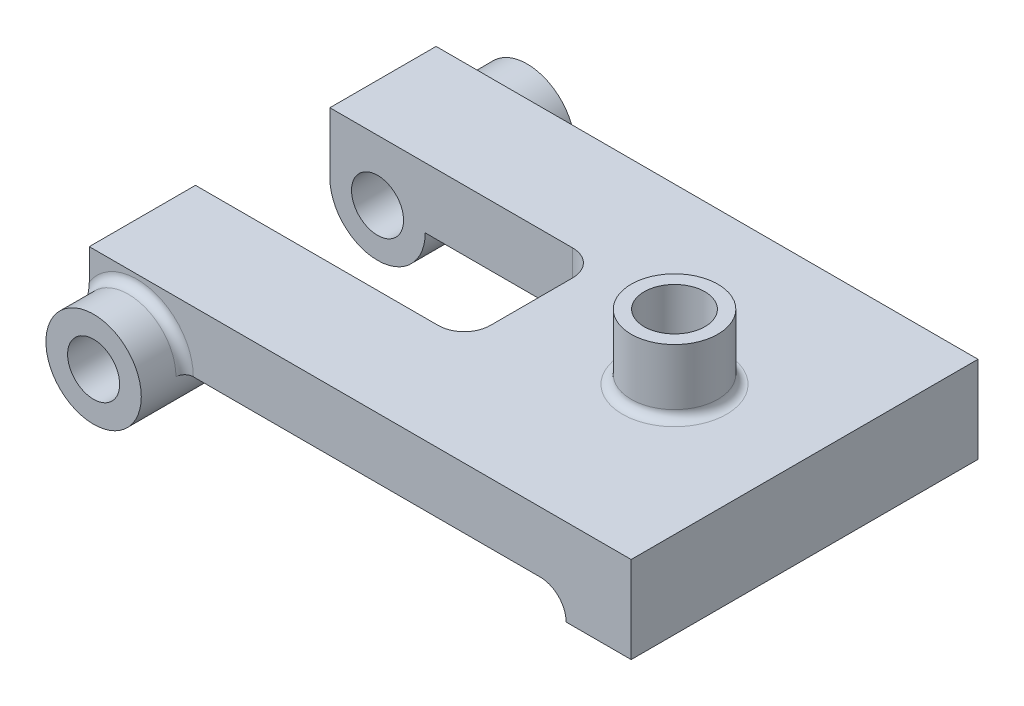
ISO-10303-21;
HEADER;
FILE_DESCRIPTION(('STEP AP214'),'2;1');
FILE_NAME('part.step','',(''),(''),'','','');
FILE_SCHEMA(('AUTOMOTIVE_DESIGN { 1 0 10303 214 1 1 1 1 }'));
ENDSEC;
DATA;
#1=APPLICATION_CONTEXT('core data for automotive mechanical design processes');
#2=APPLICATION_PROTOCOL_DEFINITION('international standard','automotive_design',2000,#1);
#3=PRODUCT_CONTEXT('',#1,'mechanical');
#4=PRODUCT('Part','Part','',(#3));
#5=PRODUCT_RELATED_PRODUCT_CATEGORY('part','',(#4));
#6=PRODUCT_DEFINITION_FORMATION('','',#4);
#7=PRODUCT_DEFINITION_CONTEXT('part definition',#1,'design');
#8=PRODUCT_DEFINITION('design','',#6,#7);
#9=PRODUCT_DEFINITION_SHAPE('','',#8);
#10=(LENGTH_UNIT() NAMED_UNIT(*) SI_UNIT(.MILLI.,.METRE.));
#11=(NAMED_UNIT(*) PLANE_ANGLE_UNIT() SI_UNIT($,.RADIAN.));
#12=(NAMED_UNIT(*) SI_UNIT($,.STERADIAN.) SOLID_ANGLE_UNIT());
#13=UNCERTAINTY_MEASURE_WITH_UNIT(LENGTH_MEASURE(1.E-05),#10,'distance_accuracy_value','');
#14=(GEOMETRIC_REPRESENTATION_CONTEXT(3) GLOBAL_UNCERTAINTY_ASSIGNED_CONTEXT((#13)) GLOBAL_UNIT_ASSIGNED_CONTEXT((#10,
#11,#12)) REPRESENTATION_CONTEXT('',''));
#15=CARTESIAN_POINT('',(0.,0.,0.));
#16=DIRECTION('',(0.,0.,1.));
#17=DIRECTION('',(1.,0.,0.));
#18=AXIS2_PLACEMENT_3D('',#15,#16,#17);
#19=CARTESIAN_POINT('',(0.,0.,40.));
#20=DIRECTION('',(-1.,0.,0.));
#21=DIRECTION('',(0.,0.,1.));
#22=AXIS2_PLACEMENT_3D('',#19,#20,#21);
#23=PLANE('',#22);
#24=DIRECTION('',(0.,0.,-1.));
#25=VECTOR('',#24,1.);
#26=CARTESIAN_POINT('',(0.,0.,40.));
#27=LINE('',#26,#25);
#28=CARTESIAN_POINT('',(0.,0.,-15.5));
#29=VERTEX_POINT('',#28);
#30=CARTESIAN_POINT('',(0.,0.,-42.));
#31=VERTEX_POINT('',#30);
#32=EDGE_CURVE('E313',#29,#31,#27,.T.);
#33=ORIENTED_EDGE('',*,*,#32,.F.);
#34=DIRECTION('',(0.,1.,0.));
#35=VECTOR('',#34,1.);
#36=CARTESIAN_POINT('',(0.,-11.,-15.5));
#37=LINE('',#36,#35);
#38=CARTESIAN_POINT('',(0.,14.,-15.5));
#39=VERTEX_POINT('',#38);
#40=EDGE_CURVE('E170',#29,#39,#37,.T.);
#41=ORIENTED_EDGE('',*,*,#40,.T.);
#42=DIRECTION('',(0.,0.,-1.));
#43=VECTOR('',#42,1.);
#44=CARTESIAN_POINT('',(0.,14.,40.));
#45=LINE('',#44,#43);
#46=CARTESIAN_POINT('',(0.,14.,-40.));
#47=VERTEX_POINT('',#46);
#48=EDGE_CURVE('E183',#39,#47,#45,.T.);
#49=ORIENTED_EDGE('',*,*,#48,.T.);
#50=DIRECTION('',(0.,1.,0.));
#51=VECTOR('',#50,1.);
#52=CARTESIAN_POINT('',(0.,0.,-40.));
#53=LINE('',#52,#51);
#54=CARTESIAN_POINT('',(0.,6.9282032302755,-40.));
#55=VERTEX_POINT('',#54);
#56=EDGE_CURVE('E337',#55,#47,#53,.T.);
#57=ORIENTED_EDGE('',*,*,#56,.F.);
#58=CARTESIAN_POINT('',(0.,6.9282032302755,-40.));
#59=CARTESIAN_POINT('',(0.,6.79631878338515,-40.0000195877206));
#60=CARTESIAN_POINT('',(0.,6.66447731425405,-40.0037039568171));
#61=CARTESIAN_POINT('',(0.,6.40121335984436,-40.0176384033789));
#62=CARTESIAN_POINT('',(0.,6.2697906737488,-40.0278846179914));
#63=CARTESIAN_POINT('',(0.,6.00790763005022,-40.05414400863));
#64=CARTESIAN_POINT('',(0.,5.87744561018524,-40.0701410055858));
#65=CARTESIAN_POINT('',(0.,5.61724352656419,-40.1072767015456));
#66=CARTESIAN_POINT('',(0.,5.4875035837544,-40.1284162368862));
#67=CARTESIAN_POINT('',(0.,5.10222369832736,-40.1981930126904));
#68=CARTESIAN_POINT('',(0.,4.84787990643123,-40.2534888297207));
#69=CARTESIAN_POINT('',(0.,4.34256909228552,-40.3782545428355));
#70=CARTESIAN_POINT('',(0.,4.09160501060091,-40.4477360266856));
#71=CARTESIAN_POINT('',(0.,3.51579220612546,-40.6210301613932));
#72=CARTESIAN_POINT('',(0.,3.19214679587766,-40.7288093836499));
#73=CARTESIAN_POINT('',(0.,2.54957173398174,-40.9576910405922));
#74=CARTESIAN_POINT('',(0.,2.23064375632853,-41.0787980818531));
#75=CARTESIAN_POINT('',(0.,1.27744390125108,-41.4553689198575));
#76=CARTESIAN_POINT('',(0.,0.648288026437424,-41.723569788079));
#77=CARTESIAN_POINT('',(0.,0.012863507876059,-41.9945149951134));
#78=CARTESIAN_POINT('',(0.,0.00643174896310646,-41.9972575065248));
#79=CARTESIAN_POINT('',(0.,0.,-42.));
#80=B_SPLINE_CURVE_WITH_KNOTS('',3,(#58,#59,#60,#61,#62,#63,#64,#65,#66,#67,#68,#69,#70,#71,#72,
#73,#74,#75,#76,#77,#78,#79),.UNSPECIFIED.,.F.,.F.,(4,2,2,2,2,2,2,2,2,2,4),(0.,0.39554064276329,
0.790848650889556,1.18505310551353,1.57932171293813,2.35959856433535,3.14051536472971,
4.16341984179175,5.18667898860517,7.23803512077279,7.25901129773622),.UNSPECIFIED.);
#81=EDGE_CURVE('E242',#55,#31,#80,.T.);
#82=ORIENTED_EDGE('',*,*,#81,.T.);
#83=EDGE_LOOP('',(#33,#41,#49,#57,#82));
#84=FACE_BOUND('',#83,.T.);
#85=ADVANCED_FACE('F41',(#84),#23,.T.);
#86=CARTESIAN_POINT('',(11.,0.,40.));
#87=DIRECTION('',(0.,0.,-1.));
#88=DIRECTION('',(-1.,0.,0.));
#89=AXIS2_PLACEMENT_3D('',#86,#87,#88);
#90=CYLINDRICAL_SURFACE('',#89,11.);
#91=CARTESIAN_POINT('',(11.,0.,50.));
#92=DIRECTION('',(0.,0.,1.));
#93=DIRECTION('',(1.,0.,0.));
#94=AXIS2_PLACEMENT_3D('',#91,#92,#93);
#95=CIRCLE('',#94,11.);
#96=CARTESIAN_POINT('',(22.,0.,50.));
#97=VERTEX_POINT('',#96);
#98=EDGE_CURVE('E330',#97,#97,#95,.T.);
#99=ORIENTED_EDGE('',*,*,#98,.F.);
#100=EDGE_LOOP('',(#99));
#101=FACE_BOUND('',#100,.T.);
#102=DIRECTION('',(0.,0.,-1.));
#103=VECTOR('',#102,1.);
#104=CARTESIAN_POINT('',(22.,0.,40.));
#105=LINE('',#104,#103);
#106=CARTESIAN_POINT('',(22.,0.,42.));
#107=VERTEX_POINT('',#106);
#108=CARTESIAN_POINT('',(22.,0.,15.5));
#109=VERTEX_POINT('',#108);
#110=EDGE_CURVE('E65',#107,#109,#105,.T.);
#111=ORIENTED_EDGE('',*,*,#110,.F.);
#112=CARTESIAN_POINT('',(11.,0.,42.));
#113=DIRECTION('',(0.,0.,1.));
#114=DIRECTION('',(1.,0.,0.));
#115=AXIS2_PLACEMENT_3D('',#112,#113,#114);
#116=CIRCLE('',#115,11.);
#117=CARTESIAN_POINT('',(0.,0.,42.));
#118=VERTEX_POINT('',#117);
#119=EDGE_CURVE('E239',#107,#118,#116,.T.);
#120=ORIENTED_EDGE('',*,*,#119,.T.);
#121=CARTESIAN_POINT('',(0.,0.,15.5));
#122=VERTEX_POINT('',#121);
#123=EDGE_CURVE('E67',#118,#122,#27,.T.);
#124=ORIENTED_EDGE('',*,*,#123,.T.);
#125=CARTESIAN_POINT('',(11.,0.,15.5));
#126=DIRECTION('',(0.,0.,1.));
#127=DIRECTION('',(1.,0.,0.));
#128=AXIS2_PLACEMENT_3D('',#125,#126,#127);
#129=CIRCLE('',#128,11.);
#130=EDGE_CURVE('E164',#122,#109,#129,.T.);
#131=ORIENTED_EDGE('',*,*,#130,.T.);
#132=EDGE_LOOP('',(#111,#120,#124,#131));
#133=FACE_BOUND('',#132,.T.);
#134=ADVANCED_FACE('F283',(#101,#133),#90,.T.);
#135=CARTESIAN_POINT('',(11.,0.,40.));
#136=DIRECTION('',(0.,0.,-1.));
#137=DIRECTION('',(-1.,0.,0.));
#138=AXIS2_PLACEMENT_3D('',#135,#136,#137);
#139=CYLINDRICAL_SURFACE('',#138,6.);
#140=CARTESIAN_POINT('',(11.,0.,-15.5));
#141=DIRECTION('',(0.,0.,-1.));
#142=DIRECTION('',(-1.,0.,0.));
#143=AXIS2_PLACEMENT_3D('',#140,#141,#142);
#144=CIRCLE('',#143,6.);
#145=CARTESIAN_POINT('',(4.99999999999999,0.,-15.5));
#146=VERTEX_POINT('',#145);
#147=EDGE_CURVE('E202',#146,#146,#144,.T.);
#148=ORIENTED_EDGE('',*,*,#147,.F.);
#149=EDGE_LOOP('',(#148));
#150=FACE_BOUND('',#149,.T.);
#151=CARTESIAN_POINT('',(11.,0.,-50.));
#152=DIRECTION('',(0.,0.,1.));
#153=DIRECTION('',(1.,0.,0.));
#154=AXIS2_PLACEMENT_3D('',#151,#152,#153);
#155=CIRCLE('',#154,6.);
#156=CARTESIAN_POINT('',(17.,0.,-50.));
#157=VERTEX_POINT('',#156);
#158=EDGE_CURVE('E430',#157,#157,#155,.T.);
#159=ORIENTED_EDGE('',*,*,#158,.F.);
#160=EDGE_LOOP('',(#159));
#161=FACE_BOUND('',#160,.T.);
#162=ADVANCED_FACE('F285',(#150,#161),#139,.F.);
#163=CARTESIAN_POINT('',(11.,0.,-42.));
#164=DIRECTION('',(0.,0.,1.));
#165=DIRECTION('',(1.,0.,0.));
#166=AXIS2_PLACEMENT_3D('',#163,#164,#165);
#167=CIRCLE('',#166,11.);
#168=CARTESIAN_POINT('',(22.,0.,-42.));
#169=VERTEX_POINT('',#168);
#170=EDGE_CURVE('E233',#31,#169,#167,.F.);
#171=ORIENTED_EDGE('',*,*,#170,.T.);
#172=CARTESIAN_POINT('',(22.,0.,-15.5));
#173=VERTEX_POINT('',#172);
#174=EDGE_CURVE('E196',#173,#169,#105,.T.);
#175=ORIENTED_EDGE('',*,*,#174,.F.);
#176=CARTESIAN_POINT('',(11.,0.,-15.5));
#177=DIRECTION('',(0.,0.,-1.));
#178=DIRECTION('',(-1.,0.,0.));
#179=AXIS2_PLACEMENT_3D('',#176,#177,#178);
#180=CIRCLE('',#179,11.);
#181=EDGE_CURVE('E425',#173,#29,#180,.T.);
#182=ORIENTED_EDGE('',*,*,#181,.T.);
#183=ORIENTED_EDGE('',*,*,#32,.T.);
#184=EDGE_LOOP('',(#171,#175,#182,#183));
#185=FACE_BOUND('',#184,.T.);
#186=CARTESIAN_POINT('',(11.,0.,-50.));
#187=DIRECTION('',(0.,0.,1.));
#188=DIRECTION('',(1.,0.,0.));
#189=AXIS2_PLACEMENT_3D('',#186,#187,#188);
#190=CIRCLE('',#189,11.);
#191=CARTESIAN_POINT('',(22.,0.,-50.));
#192=VERTEX_POINT('',#191);
#193=EDGE_CURVE('E348',#192,#192,#190,.T.);
#194=ORIENTED_EDGE('',*,*,#193,.T.);
#195=EDGE_LOOP('',(#194));
#196=FACE_BOUND('',#195,.T.);
#197=ADVANCED_FACE('F279',(#185,#196),#90,.T.);
#198=CARTESIAN_POINT('',(0.,0.,40.));
#199=DIRECTION('',(0.,-1.,0.));
#200=DIRECTION('',(0.,0.,-1.));
#201=AXIS2_PLACEMENT_3D('',#198,#199,#200);
#202=PLANE('',#201);
#203=CARTESIAN_POINT('',(95.,0.,0.));
#204=DIRECTION('',(0.,-1.,0.));
#205=DIRECTION('',(0.,0.,-1.));
#206=AXIS2_PLACEMENT_3D('',#203,#204,#205);
#207=CIRCLE('',#206,6.99999999999999);
#208=CARTESIAN_POINT('',(95.,0.,-6.99999999999999));
#209=VERTEX_POINT('',#208);
#210=EDGE_CURVE('E177',#209,#209,#207,.T.);
#211=ORIENTED_EDGE('',*,*,#210,.F.);
#212=EDGE_LOOP('',(#211));
#213=FACE_BOUND('',#212,.T.);
#214=DIRECTION('',(1.,0.,0.));
#215=VECTOR('',#214,1.);
#216=CARTESIAN_POINT('',(0.,0.,-15.5));
#217=LINE('',#216,#215);
#218=CARTESIAN_POINT('',(56.,0.,-15.5));
#219=VERTEX_POINT('',#218);
#220=EDGE_CURVE('E208',#173,#219,#217,.T.);
#221=ORIENTED_EDGE('',*,*,#220,.F.);
#222=ORIENTED_EDGE('',*,*,#174,.T.);
#223=CARTESIAN_POINT('',(24.,0.,-42.));
#224=DIRECTION('',(0.,-1.,0.));
#225=DIRECTION('',(0.,0.,-1.));
#226=AXIS2_PLACEMENT_3D('',#223,#224,#225);
#227=CIRCLE('',#226,2.);
#228=CARTESIAN_POINT('',(24.,0.,-40.));
#229=VERTEX_POINT('',#228);
#230=EDGE_CURVE('E241',#169,#229,#227,.F.);
#231=ORIENTED_EDGE('',*,*,#230,.T.);
#232=DIRECTION('',(-1.,0.,0.));
#233=VECTOR('',#232,1.);
#234=CARTESIAN_POINT('',(0.,0.,-40.));
#235=LINE('',#234,#233);
#236=CARTESIAN_POINT('',(104.,0.,-40.));
#237=VERTEX_POINT('',#236);
#238=EDGE_CURVE('E323',#237,#229,#235,.T.);
#239=ORIENTED_EDGE('',*,*,#238,.F.);
#240=DIRECTION('',(0.,0.,-1.));
#241=VECTOR('',#240,1.);
#242=CARTESIAN_POINT('',(104.,0.,40.));
#243=LINE('',#242,#241);
#244=CARTESIAN_POINT('',(104.,0.,40.));
#245=VERTEX_POINT('',#244);
#246=EDGE_CURVE('E198',#245,#237,#243,.T.);
#247=ORIENTED_EDGE('',*,*,#246,.F.);
#248=DIRECTION('',(-1.,0.,0.));
#249=VECTOR('',#248,1.);
#250=CARTESIAN_POINT('',(0.,0.,40.));
#251=LINE('',#250,#249);
#252=CARTESIAN_POINT('',(24.,0.,40.));
#253=VERTEX_POINT('',#252);
#254=EDGE_CURVE('E338',#245,#253,#251,.T.);
#255=ORIENTED_EDGE('',*,*,#254,.T.);
#256=CARTESIAN_POINT('',(24.,0.,42.));
#257=DIRECTION('',(0.,-1.,0.));
#258=DIRECTION('',(0.,0.,-1.));
#259=AXIS2_PLACEMENT_3D('',#256,#257,#258);
#260=CIRCLE('',#259,2.);
#261=EDGE_CURVE('E54',#253,#107,#260,.F.);
#262=ORIENTED_EDGE('',*,*,#261,.T.);
#263=ORIENTED_EDGE('',*,*,#110,.T.);
#264=DIRECTION('',(-1.,0.,0.));
#265=VECTOR('',#264,1.);
#266=CARTESIAN_POINT('',(0.,0.,15.5));
#267=LINE('',#266,#265);
#268=CARTESIAN_POINT('',(56.,0.,15.5));
#269=VERTEX_POINT('',#268);
#270=EDGE_CURVE('E204',#269,#109,#267,.T.);
#271=ORIENTED_EDGE('',*,*,#270,.F.);
#272=CARTESIAN_POINT('',(56.,0.,9.5));
#273=DIRECTION('',(0.,-1.,0.));
#274=DIRECTION('',(0.,0.,-1.));
#275=AXIS2_PLACEMENT_3D('',#272,#273,#274);
#276=CIRCLE('',#275,6.);
#277=CARTESIAN_POINT('',(62.,0.,9.5));
#278=VERTEX_POINT('',#277);
#279=EDGE_CURVE('E218',#269,#278,#276,.F.);
#280=ORIENTED_EDGE('',*,*,#279,.T.);
#281=DIRECTION('',(0.,0.,1.));
#282=VECTOR('',#281,1.);
#283=CARTESIAN_POINT('',(62.,0.,40.));
#284=LINE('',#283,#282);
#285=CARTESIAN_POINT('',(62.,0.,-9.49999999999999));
#286=VERTEX_POINT('',#285);
#287=EDGE_CURVE('E424',#286,#278,#284,.T.);
#288=ORIENTED_EDGE('',*,*,#287,.F.);
#289=CARTESIAN_POINT('',(56.,0.,-9.49999999999999));
#290=DIRECTION('',(0.,-1.,0.));
#291=DIRECTION('',(0.,0.,-1.));
#292=AXIS2_PLACEMENT_3D('',#289,#290,#291);
#293=CIRCLE('',#292,6.);
#294=EDGE_CURVE('E224',#286,#219,#293,.F.);
#295=ORIENTED_EDGE('',*,*,#294,.T.);
#296=EDGE_LOOP('',(#221,#222,#231,#239,#247,#255,#262,#263,#271,#280,#288,#295));
#297=FACE_BOUND('',#296,.T.);
#298=ADVANCED_FACE('F273',(#213,#297),#202,.T.);
#299=CARTESIAN_POINT('',(104.,-6.,40.));
#300=DIRECTION('',(0.,0.,-1.));
#301=DIRECTION('',(-1.,0.,0.));
#302=AXIS2_PLACEMENT_3D('',#299,#300,#301);
#303=CYLINDRICAL_SURFACE('',#302,6.);
#304=CARTESIAN_POINT('',(104.,-6.,-40.));
#305=DIRECTION('',(0.,0.,1.));
#306=DIRECTION('',(1.,0.,0.));
#307=AXIS2_PLACEMENT_3D('',#304,#305,#306);
#308=CIRCLE('',#307,6.);
#309=CARTESIAN_POINT('',(110.,-5.99999999999998,-40.));
#310=VERTEX_POINT('',#309);
#311=EDGE_CURVE('E326',#310,#237,#308,.T.);
#312=ORIENTED_EDGE('',*,*,#311,.F.);
#313=DIRECTION('',(0.,0.,-1.));
#314=VECTOR('',#313,1.);
#315=CARTESIAN_POINT('',(110.,-5.99999999999998,40.));
#316=LINE('',#315,#314);
#317=CARTESIAN_POINT('',(110.,-5.99999999999998,40.));
#318=VERTEX_POINT('',#317);
#319=EDGE_CURVE('E192',#318,#310,#316,.T.);
#320=ORIENTED_EDGE('',*,*,#319,.F.);
#321=CARTESIAN_POINT('',(104.,-6.,40.));
#322=DIRECTION('',(0.,0.,1.));
#323=DIRECTION('',(1.,0.,0.));
#324=AXIS2_PLACEMENT_3D('',#321,#322,#323);
#325=CIRCLE('',#324,6.);
#326=EDGE_CURVE('E345',#318,#245,#325,.T.);
#327=ORIENTED_EDGE('',*,*,#326,.T.);
#328=ORIENTED_EDGE('',*,*,#246,.T.);
#329=EDGE_LOOP('',(#312,#320,#327,#328));
#330=FACE_BOUND('',#329,.T.);
#331=ADVANCED_FACE('F269',(#330),#303,.F.);
#332=CARTESIAN_POINT('',(0.,-6.00000000000002,40.));
#333=DIRECTION('',(0.,-1.,0.));
#334=DIRECTION('',(1.,0.,0.));
#335=AXIS2_PLACEMENT_3D('',#332,#333,#334);
#336=PLANE('',#335);
#337=DIRECTION('',(-1.,0.,0.));
#338=VECTOR('',#337,1.);
#339=CARTESIAN_POINT('',(0.,-6.00000000000002,-40.));
#340=LINE('',#339,#338);
#341=CARTESIAN_POINT('',(125.,-5.99999999999998,-40.));
#342=VERTEX_POINT('',#341);
#343=EDGE_CURVE('E329',#342,#310,#340,.T.);
#344=ORIENTED_EDGE('',*,*,#343,.F.);
#345=DIRECTION('',(0.,0.,-1.));
#346=VECTOR('',#345,1.);
#347=CARTESIAN_POINT('',(125.,-5.99999999999998,40.));
#348=LINE('',#347,#346);
#349=CARTESIAN_POINT('',(125.,-5.99999999999998,40.));
#350=VERTEX_POINT('',#349);
#351=EDGE_CURVE('E190',#350,#342,#348,.T.);
#352=ORIENTED_EDGE('',*,*,#351,.F.);
#353=DIRECTION('',(-1.,0.,0.));
#354=VECTOR('',#353,1.);
#355=CARTESIAN_POINT('',(0.,-6.00000000000002,40.));
#356=LINE('',#355,#354);
#357=EDGE_CURVE('E350',#350,#318,#356,.T.);
#358=ORIENTED_EDGE('',*,*,#357,.T.);
#359=ORIENTED_EDGE('',*,*,#319,.T.);
#360=EDGE_LOOP('',(#344,#352,#358,#359));
#361=FACE_BOUND('',#360,.T.);
#362=ADVANCED_FACE('F266',(#361),#336,.T.);
#363=CARTESIAN_POINT('',(125.,0.,40.));
#364=DIRECTION('',(1.,0.,0.));
#365=DIRECTION('',(0.,0.,-1.));
#366=AXIS2_PLACEMENT_3D('',#363,#364,#365);
#367=PLANE('',#366);
#368=DIRECTION('',(0.,-1.,0.));
#369=VECTOR('',#368,1.);
#370=CARTESIAN_POINT('',(125.,0.,-40.));
#371=LINE('',#370,#369);
#372=CARTESIAN_POINT('',(125.,14.,-40.));
#373=VERTEX_POINT('',#372);
#374=EDGE_CURVE('E334',#373,#342,#371,.T.);
#375=ORIENTED_EDGE('',*,*,#374,.F.);
#376=DIRECTION('',(0.,0.,-1.));
#377=VECTOR('',#376,1.);
#378=CARTESIAN_POINT('',(125.,14.,40.));
#379=LINE('',#378,#377);
#380=CARTESIAN_POINT('',(125.,14.,40.));
#381=VERTEX_POINT('',#380);
#382=EDGE_CURVE('E184',#381,#373,#379,.T.);
#383=ORIENTED_EDGE('',*,*,#382,.F.);
#384=DIRECTION('',(0.,-1.,0.));
#385=VECTOR('',#384,1.);
#386=CARTESIAN_POINT('',(125.,0.,40.));
#387=LINE('',#386,#385);
#388=EDGE_CURVE('E317',#381,#350,#387,.T.);
#389=ORIENTED_EDGE('',*,*,#388,.T.);
#390=ORIENTED_EDGE('',*,*,#351,.T.);
#391=EDGE_LOOP('',(#375,#383,#389,#390));
#392=FACE_BOUND('',#391,.T.);
#393=ADVANCED_FACE('F265',(#392),#367,.T.);
#394=CARTESIAN_POINT('',(0.,14.,40.));
#395=DIRECTION('',(0.,1.,0.));
#396=DIRECTION('',(0.,0.,1.));
#397=AXIS2_PLACEMENT_3D('',#394,#395,#396);
#398=PLANE('',#397);
#399=CARTESIAN_POINT('',(95.,14.,0.));
#400=DIRECTION('',(0.,1.,0.));
#401=DIRECTION('',(0.,0.,1.));
#402=AXIS2_PLACEMENT_3D('',#399,#400,#401);
#403=CIRCLE('',#402,12.);
#404=CARTESIAN_POINT('',(95.,14.,12.));
#405=VERTEX_POINT('',#404);
#406=EDGE_CURVE('E227',#405,#405,#403,.F.);
#407=ORIENTED_EDGE('',*,*,#406,.T.);
#408=EDGE_LOOP('',(#407));
#409=FACE_BOUND('',#408,.T.);
#410=DIRECTION('',(1.,0.,0.));
#411=VECTOR('',#410,1.);
#412=CARTESIAN_POINT('',(0.,14.,15.5));
#413=LINE('',#412,#411);
#414=CARTESIAN_POINT('',(0.,14.,15.5));
#415=VERTEX_POINT('',#414);
#416=CARTESIAN_POINT('',(56.,14.,15.5));
#417=VERTEX_POINT('',#416);
#418=EDGE_CURVE('E162',#415,#417,#413,.T.);
#419=ORIENTED_EDGE('',*,*,#418,.F.);
#420=CARTESIAN_POINT('',(0.,14.,40.));
#421=VERTEX_POINT('',#420);
#422=EDGE_CURVE('E173',#421,#415,#45,.T.);
#423=ORIENTED_EDGE('',*,*,#422,.F.);
#424=DIRECTION('',(1.,0.,0.));
#425=VECTOR('',#424,1.);
#426=CARTESIAN_POINT('',(0.,14.,40.));
#427=LINE('',#426,#425);
#428=EDGE_CURVE('E320',#421,#381,#427,.T.);
#429=ORIENTED_EDGE('',*,*,#428,.T.);
#430=ORIENTED_EDGE('',*,*,#382,.T.);
#431=DIRECTION('',(1.,0.,0.));
#432=VECTOR('',#431,1.);
#433=CARTESIAN_POINT('',(0.,14.,-40.));
#434=LINE('',#433,#432);
#435=EDGE_CURVE('E336',#47,#373,#434,.T.);
#436=ORIENTED_EDGE('',*,*,#435,.F.);
#437=ORIENTED_EDGE('',*,*,#48,.F.);
#438=DIRECTION('',(-1.,0.,0.));
#439=VECTOR('',#438,1.);
#440=CARTESIAN_POINT('',(0.,14.,-15.5));
#441=LINE('',#440,#439);
#442=CARTESIAN_POINT('',(56.,14.,-15.5));
#443=VERTEX_POINT('',#442);
#444=EDGE_CURVE('E169',#443,#39,#441,.T.);
#445=ORIENTED_EDGE('',*,*,#444,.F.);
#446=CARTESIAN_POINT('',(56.,14.,-9.49999999999999));
#447=DIRECTION('',(0.,1.,0.));
#448=DIRECTION('',(0.,0.,1.));
#449=AXIS2_PLACEMENT_3D('',#446,#447,#448);
#450=CIRCLE('',#449,6.);
#451=CARTESIAN_POINT('',(62.,14.,-9.49999999999999));
#452=VERTEX_POINT('',#451);
#453=EDGE_CURVE('E222',#443,#452,#450,.F.);
#454=ORIENTED_EDGE('',*,*,#453,.T.);
#455=DIRECTION('',(0.,0.,-1.));
#456=VECTOR('',#455,1.);
#457=CARTESIAN_POINT('',(62.,14.,15.5));
#458=LINE('',#457,#456);
#459=CARTESIAN_POINT('',(62.,14.,9.5));
#460=VERTEX_POINT('',#459);
#461=EDGE_CURVE('E176',#460,#452,#458,.T.);
#462=ORIENTED_EDGE('',*,*,#461,.F.);
#463=CARTESIAN_POINT('',(56.,14.,9.5));
#464=DIRECTION('',(0.,1.,0.));
#465=DIRECTION('',(0.,0.,1.));
#466=AXIS2_PLACEMENT_3D('',#463,#464,#465);
#467=CIRCLE('',#466,6.);
#468=EDGE_CURVE('E180',#460,#417,#467,.F.);
#469=ORIENTED_EDGE('',*,*,#468,.T.);
#470=EDGE_LOOP('',(#419,#423,#429,#430,#436,#437,#445,#454,#462,#469));
#471=FACE_BOUND('',#470,.T.);
#472=ADVANCED_FACE('F175',(#409,#471),#398,.T.);
#473=DIRECTION('',(0.,1.,0.));
#474=VECTOR('',#473,1.);
#475=CARTESIAN_POINT('',(0.,-11.,15.5));
#476=LINE('',#475,#474);
#477=EDGE_CURVE('E159',#122,#415,#476,.T.);
#478=ORIENTED_EDGE('',*,*,#477,.F.);
#479=ORIENTED_EDGE('',*,*,#123,.F.);
#480=CARTESIAN_POINT('',(0.,6.9282032302755,40.));
#481=CARTESIAN_POINT('',(0.,6.79631878338515,40.0000195877206));
#482=CARTESIAN_POINT('',(0.,6.66447731425405,40.0037039568171));
#483=CARTESIAN_POINT('',(0.,6.40121335984436,40.0176384033789));
#484=CARTESIAN_POINT('',(0.,6.2697906737488,40.0278846179914));
#485=CARTESIAN_POINT('',(0.,6.00790763005022,40.05414400863));
#486=CARTESIAN_POINT('',(0.,5.87744561018524,40.0701410055858));
#487=CARTESIAN_POINT('',(0.,5.61724352656419,40.1072767015456));
#488=CARTESIAN_POINT('',(0.,5.4875035837544,40.1284162368862));
#489=CARTESIAN_POINT('',(0.,5.10222369832736,40.1981930126904));
#490=CARTESIAN_POINT('',(0.,4.84787990643123,40.2534888297207));
#491=CARTESIAN_POINT('',(0.,4.34256909228552,40.3782545428355));
#492=CARTESIAN_POINT('',(0.,4.09160501060091,40.4477360266856));
#493=CARTESIAN_POINT('',(0.,3.51579220612546,40.6210301613932));
#494=CARTESIAN_POINT('',(0.,3.19214679587766,40.7288093836499));
#495=CARTESIAN_POINT('',(0.,2.54957173398174,40.9576910405922));
#496=CARTESIAN_POINT('',(0.,2.23064375632853,41.0787980818531));
#497=CARTESIAN_POINT('',(0.,1.27744390125108,41.4553689198575));
#498=CARTESIAN_POINT('',(0.,0.648288026437424,41.723569788079));
#499=CARTESIAN_POINT('',(0.,0.012863507876059,41.9945149951134));
#500=CARTESIAN_POINT('',(0.,0.00643174896310646,41.9972575065248));
#501=CARTESIAN_POINT('',(0.,0.,42.));
#502=B_SPLINE_CURVE_WITH_KNOTS('',3,(#480,#481,#482,#483,#484,#485,#486,#487,#488,#489,#490,
#491,#492,#493,#494,#495,#496,#497,#498,#499,#500,#501),.UNSPECIFIED.,.F.,.F.,(4,2,2,2,2,2,2,2,
2,2,4),(0.,0.39554064276329,0.790848650889556,1.18505310551353,1.57932171293813,
2.35959856433535,3.14051536472971,4.16341984179175,5.18667898860517,7.23803512077279,
7.25901129773622),.UNSPECIFIED.);
#503=CARTESIAN_POINT('',(0.,6.9282032302755,40.));
#504=VERTEX_POINT('',#503);
#505=EDGE_CURVE('E11',#118,#504,#502,.F.);
#506=ORIENTED_EDGE('',*,*,#505,.T.);
#507=DIRECTION('',(0.,1.,0.));
#508=VECTOR('',#507,1.);
#509=CARTESIAN_POINT('',(0.,0.,40.));
#510=LINE('',#509,#508);
#511=EDGE_CURVE('E181',#504,#421,#510,.T.);
#512=ORIENTED_EDGE('',*,*,#511,.T.);
#513=ORIENTED_EDGE('',*,*,#422,.T.);
#514=EDGE_LOOP('',(#478,#479,#506,#512,#513));
#515=FACE_BOUND('',#514,.T.);
#516=ADVANCED_FACE('F182',(#515),#23,.T.);
#517=CARTESIAN_POINT('',(0.,0.,40.));
#518=DIRECTION('',(0.,0.,1.));
#519=DIRECTION('',(1.,0.,0.));
#520=AXIS2_PLACEMENT_3D('',#517,#518,#519);
#521=PLANE('',#520);
#522=ORIENTED_EDGE('',*,*,#511,.F.);
#523=CARTESIAN_POINT('',(11.,0.,40.));
#524=DIRECTION('',(0.,0.,1.));
#525=DIRECTION('',(1.,0.,0.));
#526=AXIS2_PLACEMENT_3D('',#523,#524,#525);
#527=CIRCLE('',#526,13.);
#528=EDGE_CURVE('E237',#504,#253,#527,.F.);
#529=ORIENTED_EDGE('',*,*,#528,.T.);
#530=ORIENTED_EDGE('',*,*,#254,.F.);
#531=ORIENTED_EDGE('',*,*,#326,.F.);
#532=ORIENTED_EDGE('',*,*,#357,.F.);
#533=ORIENTED_EDGE('',*,*,#388,.F.);
#534=ORIENTED_EDGE('',*,*,#428,.F.);
#535=EDGE_LOOP('',(#522,#529,#530,#531,#532,#533,#534));
#536=FACE_BOUND('',#535,.T.);
#537=ADVANCED_FACE('F258',(#536),#521,.T.);
#538=CARTESIAN_POINT('',(0.,0.,-40.));
#539=DIRECTION('',(0.,0.,1.));
#540=DIRECTION('',(1.,0.,0.));
#541=AXIS2_PLACEMENT_3D('',#538,#539,#540);
#542=PLANE('',#541);
#543=ORIENTED_EDGE('',*,*,#238,.T.);
#544=CARTESIAN_POINT('',(11.,0.,-40.));
#545=DIRECTION('',(0.,0.,1.));
#546=DIRECTION('',(1.,0.,0.));
#547=AXIS2_PLACEMENT_3D('',#544,#545,#546);
#548=CIRCLE('',#547,13.);
#549=EDGE_CURVE('E232',#229,#55,#548,.T.);
#550=ORIENTED_EDGE('',*,*,#549,.T.);
#551=ORIENTED_EDGE('',*,*,#56,.T.);
#552=ORIENTED_EDGE('',*,*,#435,.T.);
#553=ORIENTED_EDGE('',*,*,#374,.T.);
#554=ORIENTED_EDGE('',*,*,#343,.T.);
#555=ORIENTED_EDGE('',*,*,#311,.T.);
#556=EDGE_LOOP('',(#543,#550,#551,#552,#553,#554,#555));
#557=FACE_BOUND('',#556,.T.);
#558=ADVANCED_FACE('F362',(#557),#542,.F.);
#559=CARTESIAN_POINT('',(0.,0.,-50.));
#560=DIRECTION('',(0.,0.,1.));
#561=DIRECTION('',(1.,0.,0.));
#562=AXIS2_PLACEMENT_3D('',#559,#560,#561);
#563=PLANE('',#562);
#564=ORIENTED_EDGE('',*,*,#158,.T.);
#565=EDGE_LOOP('',(#564));
#566=FACE_BOUND('',#565,.T.);
#567=ORIENTED_EDGE('',*,*,#193,.F.);
#568=EDGE_LOOP('',(#567));
#569=FACE_BOUND('',#568,.T.);
#570=ADVANCED_FACE('F368',(#566,#569),#563,.F.);
#571=CARTESIAN_POINT('',(11.,0.,15.5));
#572=DIRECTION('',(0.,0.,1.));
#573=DIRECTION('',(1.,0.,0.));
#574=AXIS2_PLACEMENT_3D('',#571,#572,#573);
#575=CIRCLE('',#574,6.);
#576=CARTESIAN_POINT('',(17.,0.,15.5));
#577=VERTEX_POINT('',#576);
#578=EDGE_CURVE('E203',#577,#577,#575,.T.);
#579=ORIENTED_EDGE('',*,*,#578,.F.);
#580=EDGE_LOOP('',(#579));
#581=FACE_BOUND('',#580,.T.);
#582=CARTESIAN_POINT('',(11.,0.,50.));
#583=DIRECTION('',(0.,0.,1.));
#584=DIRECTION('',(1.,0.,0.));
#585=AXIS2_PLACEMENT_3D('',#582,#583,#584);
#586=CIRCLE('',#585,6.);
#587=CARTESIAN_POINT('',(17.,0.,50.));
#588=VERTEX_POINT('',#587);
#589=EDGE_CURVE('E428',#588,#588,#586,.T.);
#590=ORIENTED_EDGE('',*,*,#589,.T.);
#591=EDGE_LOOP('',(#590));
#592=FACE_BOUND('',#591,.T.);
#593=ADVANCED_FACE('F260',(#581,#592),#139,.F.);
#594=CARTESIAN_POINT('',(0.,0.,50.));
#595=DIRECTION('',(0.,0.,1.));
#596=DIRECTION('',(1.,0.,0.));
#597=AXIS2_PLACEMENT_3D('',#594,#595,#596);
#598=PLANE('',#597);
#599=ORIENTED_EDGE('',*,*,#589,.F.);
#600=EDGE_LOOP('',(#599));
#601=FACE_BOUND('',#600,.T.);
#602=ORIENTED_EDGE('',*,*,#98,.T.);
#603=EDGE_LOOP('',(#602));
#604=FACE_BOUND('',#603,.T.);
#605=ADVANCED_FACE('F374',(#601,#604),#598,.T.);
#606=CARTESIAN_POINT('',(0.,-11.,-15.5));
#607=DIRECTION('',(0.,0.,-1.));
#608=DIRECTION('',(-1.,0.,0.));
#609=AXIS2_PLACEMENT_3D('',#606,#607,#608);
#610=PLANE('',#609);
#611=ORIENTED_EDGE('',*,*,#147,.T.);
#612=EDGE_LOOP('',(#611));
#613=FACE_BOUND('',#612,.T.);
#614=ORIENTED_EDGE('',*,*,#220,.T.);
#615=DIRECTION('',(0.,1.,0.));
#616=VECTOR('',#615,1.);
#617=CARTESIAN_POINT('',(56.,14.,-15.5));
#618=LINE('',#617,#616);
#619=EDGE_CURVE('E214',#219,#443,#618,.T.);
#620=ORIENTED_EDGE('',*,*,#619,.T.);
#621=ORIENTED_EDGE('',*,*,#444,.T.);
#622=ORIENTED_EDGE('',*,*,#40,.F.);
#623=ORIENTED_EDGE('',*,*,#181,.F.);
#624=EDGE_LOOP('',(#614,#620,#621,#622,#623));
#625=FACE_BOUND('',#624,.T.);
#626=ADVANCED_FACE('F378',(#613,#625),#610,.F.);
#627=CARTESIAN_POINT('',(0.,-11.,15.5));
#628=DIRECTION('',(0.,0.,1.));
#629=DIRECTION('',(1.,0.,0.));
#630=AXIS2_PLACEMENT_3D('',#627,#628,#629);
#631=PLANE('',#630);
#632=ORIENTED_EDGE('',*,*,#578,.T.);
#633=EDGE_LOOP('',(#632));
#634=FACE_BOUND('',#633,.T.);
#635=ORIENTED_EDGE('',*,*,#418,.T.);
#636=DIRECTION('',(0.,1.,0.));
#637=VECTOR('',#636,1.);
#638=CARTESIAN_POINT('',(56.,0.,15.5));
#639=LINE('',#638,#637);
#640=EDGE_CURVE('E213',#417,#269,#639,.F.);
#641=ORIENTED_EDGE('',*,*,#640,.T.);
#642=ORIENTED_EDGE('',*,*,#270,.T.);
#643=ORIENTED_EDGE('',*,*,#130,.F.);
#644=ORIENTED_EDGE('',*,*,#477,.T.);
#645=EDGE_LOOP('',(#635,#641,#642,#643,#644));
#646=FACE_BOUND('',#645,.T.);
#647=ADVANCED_FACE('F165',(#634,#646),#631,.F.);
#648=CARTESIAN_POINT('',(62.,-11.,15.5));
#649=DIRECTION('',(1.,0.,0.));
#650=DIRECTION('',(0.,0.,-1.));
#651=AXIS2_PLACEMENT_3D('',#648,#649,#650);
#652=PLANE('',#651);
#653=ORIENTED_EDGE('',*,*,#287,.T.);
#654=DIRECTION('',(0.,1.,0.));
#655=VECTOR('',#654,1.);
#656=CARTESIAN_POINT('',(62.,14.,9.5));
#657=LINE('',#656,#655);
#658=EDGE_CURVE('E209',#278,#460,#657,.T.);
#659=ORIENTED_EDGE('',*,*,#658,.T.);
#660=ORIENTED_EDGE('',*,*,#461,.T.);
#661=DIRECTION('',(0.,1.,0.));
#662=VECTOR('',#661,1.);
#663=CARTESIAN_POINT('',(62.,0.,-9.49999999999999));
#664=LINE('',#663,#662);
#665=EDGE_CURVE('E199',#452,#286,#664,.F.);
#666=ORIENTED_EDGE('',*,*,#665,.T.);
#667=EDGE_LOOP('',(#653,#659,#660,#666));
#668=FACE_BOUND('',#667,.T.);
#669=ADVANCED_FACE('F385',(#668),#652,.F.);
#670=CARTESIAN_POINT('',(95.,-11.,0.));
#671=DIRECTION('',(0.,1.,0.));
#672=DIRECTION('',(0.,0.,1.));
#673=AXIS2_PLACEMENT_3D('',#670,#671,#672);
#674=CYLINDRICAL_SURFACE('',#673,6.99999999999999);
#675=ORIENTED_EDGE('',*,*,#210,.T.);
#676=EDGE_LOOP('',(#675));
#677=FACE_BOUND('',#676,.T.);
#678=CARTESIAN_POINT('',(95.,29.,0.));
#679=DIRECTION('',(0.,1.,0.));
#680=DIRECTION('',(0.,0.,1.));
#681=AXIS2_PLACEMENT_3D('',#678,#679,#680);
#682=CIRCLE('',#681,6.99999999999999);
#683=CARTESIAN_POINT('',(95.,29.,6.99999999999999));
#684=VERTEX_POINT('',#683);
#685=EDGE_CURVE('E410',#684,#684,#682,.T.);
#686=ORIENTED_EDGE('',*,*,#685,.T.);
#687=EDGE_LOOP('',(#686));
#688=FACE_BOUND('',#687,.T.);
#689=ADVANCED_FACE('F387',(#677,#688),#674,.F.);
#690=CARTESIAN_POINT('',(95.,29.,0.));
#691=DIRECTION('',(0.,1.,0.));
#692=DIRECTION('',(0.,0.,1.));
#693=AXIS2_PLACEMENT_3D('',#690,#691,#692);
#694=PLANE('',#693);
#695=CARTESIAN_POINT('',(95.,29.,0.));
#696=DIRECTION('',(0.,1.,0.));
#697=DIRECTION('',(0.,0.,1.));
#698=AXIS2_PLACEMENT_3D('',#695,#696,#697);
#699=CIRCLE('',#698,9.99999999999999);
#700=CARTESIAN_POINT('',(95.,29.,9.99999999999999));
#701=VERTEX_POINT('',#700);
#702=EDGE_CURVE('E404',#701,#701,#699,.T.);
#703=ORIENTED_EDGE('',*,*,#702,.T.);
#704=EDGE_LOOP('',(#703));
#705=FACE_BOUND('',#704,.T.);
#706=ORIENTED_EDGE('',*,*,#685,.F.);
#707=EDGE_LOOP('',(#706));
#708=FACE_BOUND('',#707,.T.);
#709=ADVANCED_FACE('F392',(#705,#708),#694,.T.);
#710=CARTESIAN_POINT('',(95.,29.,0.));
#711=DIRECTION('',(0.,-1.,0.));
#712=DIRECTION('',(0.,0.,-1.));
#713=AXIS2_PLACEMENT_3D('',#710,#711,#712);
#714=CYLINDRICAL_SURFACE('',#713,9.99999999999999);
#715=CARTESIAN_POINT('',(95.,16.,0.));
#716=DIRECTION('',(0.,1.,0.));
#717=DIRECTION('',(0.,0.,1.));
#718=AXIS2_PLACEMENT_3D('',#715,#716,#717);
#719=CIRCLE('',#718,9.99999999999999);
#720=CARTESIAN_POINT('',(95.,16.,9.99999999999999));
#721=VERTEX_POINT('',#720);
#722=EDGE_CURVE('E223',#721,#721,#719,.T.);
#723=ORIENTED_EDGE('',*,*,#722,.T.);
#724=EDGE_LOOP('',(#723));
#725=FACE_BOUND('',#724,.T.);
#726=ORIENTED_EDGE('',*,*,#702,.F.);
#727=EDGE_LOOP('',(#726));
#728=FACE_BOUND('',#727,.T.);
#729=ADVANCED_FACE('F287',(#725,#728),#714,.T.);
#730=CARTESIAN_POINT('',(56.,-11.,9.5));
#731=DIRECTION('',(0.,-1.,0.));
#732=DIRECTION('',(0.,0.,-1.));
#733=AXIS2_PLACEMENT_3D('',#730,#731,#732);
#734=CYLINDRICAL_SURFACE('',#733,6.);
#735=ORIENTED_EDGE('',*,*,#279,.F.);
#736=ORIENTED_EDGE('',*,*,#640,.F.);
#737=ORIENTED_EDGE('',*,*,#468,.F.);
#738=ORIENTED_EDGE('',*,*,#658,.F.);
#739=EDGE_LOOP('',(#735,#736,#737,#738));
#740=FACE_BOUND('',#739,.T.);
#741=ADVANCED_FACE('F284',(#740),#734,.F.);
#742=CARTESIAN_POINT('',(56.,-11.,-9.49999999999999));
#743=DIRECTION('',(0.,-1.,0.));
#744=DIRECTION('',(0.,0.,-1.));
#745=AXIS2_PLACEMENT_3D('',#742,#743,#744);
#746=CYLINDRICAL_SURFACE('',#745,6.);
#747=ORIENTED_EDGE('',*,*,#294,.F.);
#748=ORIENTED_EDGE('',*,*,#665,.F.);
#749=ORIENTED_EDGE('',*,*,#453,.F.);
#750=ORIENTED_EDGE('',*,*,#619,.F.);
#751=EDGE_LOOP('',(#747,#748,#749,#750));
#752=FACE_BOUND('',#751,.T.);
#753=ADVANCED_FACE('F286',(#752),#746,.F.);
#754=CARTESIAN_POINT('',(95.,16.,0.));
#755=DIRECTION('',(0.,1.,0.));
#756=DIRECTION('',(0.,0.,1.));
#757=AXIS2_PLACEMENT_3D('',#754,#755,#756);
#758=TOROIDAL_SURFACE('',#757,12.,2.);
#759=ORIENTED_EDGE('',*,*,#406,.F.);
#760=EDGE_LOOP('',(#759));
#761=FACE_BOUND('',#760,.T.);
#762=ORIENTED_EDGE('',*,*,#722,.F.);
#763=EDGE_LOOP('',(#762));
#764=FACE_BOUND('',#763,.T.);
#765=ADVANCED_FACE('F295',(#761,#764),#758,.F.);
#766=CARTESIAN_POINT('',(11.,0.,-42.));
#767=DIRECTION('',(0.,0.,1.));
#768=DIRECTION('',(1.,0.,0.));
#769=AXIS2_PLACEMENT_3D('',#766,#767,#768);
#770=TOROIDAL_SURFACE('',#769,13.,2.);
#771=ORIENTED_EDGE('',*,*,#81,.F.);
#772=ORIENTED_EDGE('',*,*,#549,.F.);
#773=ORIENTED_EDGE('',*,*,#230,.F.);
#774=ORIENTED_EDGE('',*,*,#170,.F.);
#775=EDGE_LOOP('',(#771,#772,#773,#774));
#776=FACE_BOUND('',#775,.T.);
#777=ADVANCED_FACE('F247',(#776),#770,.F.);
#778=CARTESIAN_POINT('',(11.,0.,42.));
#779=DIRECTION('',(0.,0.,1.));
#780=DIRECTION('',(1.,0.,0.));
#781=AXIS2_PLACEMENT_3D('',#778,#779,#780);
#782=TOROIDAL_SURFACE('',#781,13.,2.);
#783=ORIENTED_EDGE('',*,*,#505,.F.);
#784=ORIENTED_EDGE('',*,*,#119,.F.);
#785=ORIENTED_EDGE('',*,*,#261,.F.);
#786=ORIENTED_EDGE('',*,*,#528,.F.);
#787=EDGE_LOOP('',(#783,#784,#785,#786));
#788=FACE_BOUND('',#787,.T.);
#789=ADVANCED_FACE('F43',(#788),#782,.F.);
#790=CLOSED_SHELL('',(#85,#134,#162,#197,#298,#331,#362,#393,#472,#516,#537,#558,#570,#593,#605,
#626,#647,#669,#689,#709,#729,#741,#753,#765,#777,#789));
#791=MANIFOLD_SOLID_BREP('B2',#790);
#792=ADVANCED_BREP_SHAPE_REPRESENTATION('',(#18,#791),#14);
#793=SHAPE_DEFINITION_REPRESENTATION(#9,#792);
ENDSEC;
END-ISO-10303-21;
